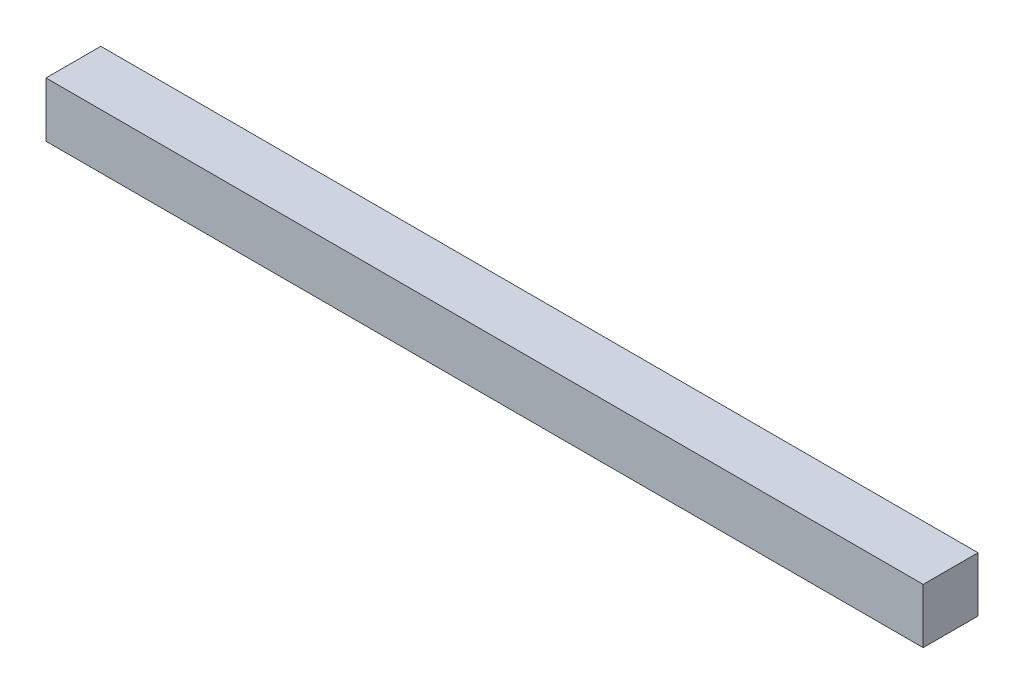
ISO-10303-21;
HEADER;
FILE_DESCRIPTION(('STEP AP214'),'2;1');
FILE_NAME('part.step','',(''),(''),'','','');
FILE_SCHEMA(('AUTOMOTIVE_DESIGN { 1 0 10303 214 1 1 1 1 }'));
ENDSEC;
DATA;
#1=APPLICATION_CONTEXT('core data for automotive mechanical design processes');
#2=APPLICATION_PROTOCOL_DEFINITION('international standard','automotive_design',2000,#1);
#3=PRODUCT_CONTEXT('',#1,'mechanical');
#4=PRODUCT('Part','Part','',(#3));
#5=PRODUCT_RELATED_PRODUCT_CATEGORY('part','',(#4));
#6=PRODUCT_DEFINITION_FORMATION('','',#4);
#7=PRODUCT_DEFINITION_CONTEXT('part definition',#1,'design');
#8=PRODUCT_DEFINITION('design','',#6,#7);
#9=PRODUCT_DEFINITION_SHAPE('','',#8);
#10=(LENGTH_UNIT() NAMED_UNIT(*) SI_UNIT(.MILLI.,.METRE.));
#11=(NAMED_UNIT(*) PLANE_ANGLE_UNIT() SI_UNIT($,.RADIAN.));
#12=(NAMED_UNIT(*) SI_UNIT($,.STERADIAN.) SOLID_ANGLE_UNIT());
#13=UNCERTAINTY_MEASURE_WITH_UNIT(LENGTH_MEASURE(1.E-05),#10,'distance_accuracy_value','');
#14=(GEOMETRIC_REPRESENTATION_CONTEXT(3) GLOBAL_UNCERTAINTY_ASSIGNED_CONTEXT((#13)) GLOBAL_UNIT_ASSIGNED_CONTEXT((#10,
#11,#12)) REPRESENTATION_CONTEXT('',''));
#15=CARTESIAN_POINT('',(0.,0.,0.));
#16=DIRECTION('',(0.,0.,1.));
#17=DIRECTION('',(1.,0.,0.));
#18=AXIS2_PLACEMENT_3D('',#15,#16,#17);
#19=CARTESIAN_POINT('',(50.8,6.35,3.175));
#20=DIRECTION('',(-1.,0.,0.));
#21=DIRECTION('',(0.,0.,1.));
#22=AXIS2_PLACEMENT_3D('',#19,#20,#21);
#23=PLANE('',#22);
#24=DIRECTION('',(0.,0.,-1.));
#25=VECTOR('',#24,1.);
#26=CARTESIAN_POINT('',(50.8,0.,3.175));
#27=LINE('',#26,#25);
#28=CARTESIAN_POINT('',(50.8,0.,3.175));
#29=VERTEX_POINT('',#28);
#30=CARTESIAN_POINT('',(50.8,0.,-3.175));
#31=VERTEX_POINT('',#30);
#32=EDGE_CURVE('E96',#29,#31,#27,.T.);
#33=ORIENTED_EDGE('',*,*,#32,.T.);
#34=DIRECTION('',(0.,-1.,0.));
#35=VECTOR('',#34,1.);
#36=CARTESIAN_POINT('',(50.8,6.35,-3.175));
#37=LINE('',#36,#35);
#38=CARTESIAN_POINT('',(50.8,6.35,-3.175));
#39=VERTEX_POINT('',#38);
#40=EDGE_CURVE('E11',#39,#31,#37,.T.);
#41=ORIENTED_EDGE('',*,*,#40,.F.);
#42=DIRECTION('',(0.,0.,-1.));
#43=VECTOR('',#42,1.);
#44=CARTESIAN_POINT('',(50.8,6.35,3.175));
#45=LINE('',#44,#43);
#46=CARTESIAN_POINT('',(50.8,6.35,3.175));
#47=VERTEX_POINT('',#46);
#48=EDGE_CURVE('E84',#47,#39,#45,.T.);
#49=ORIENTED_EDGE('',*,*,#48,.F.);
#50=DIRECTION('',(0.,-1.,0.));
#51=VECTOR('',#50,1.);
#52=CARTESIAN_POINT('',(50.8,6.35,3.175));
#53=LINE('',#52,#51);
#54=EDGE_CURVE('E92',#47,#29,#53,.T.);
#55=ORIENTED_EDGE('',*,*,#54,.T.);
#56=EDGE_LOOP('',(#33,#41,#49,#55));
#57=FACE_BOUND('',#56,.T.);
#58=ADVANCED_FACE('F33',(#57),#23,.F.);
#59=CARTESIAN_POINT('',(-50.8,6.35,-3.175));
#60=DIRECTION('',(0.,0.,1.));
#61=DIRECTION('',(1.,0.,0.));
#62=AXIS2_PLACEMENT_3D('',#59,#60,#61);
#63=PLANE('',#62);
#64=DIRECTION('',(-1.,0.,0.));
#65=VECTOR('',#64,1.);
#66=CARTESIAN_POINT('',(-50.8,0.,-3.175));
#67=LINE('',#66,#65);
#68=CARTESIAN_POINT('',(-50.8,0.,-3.175));
#69=VERTEX_POINT('',#68);
#70=EDGE_CURVE('E88',#31,#69,#67,.T.);
#71=ORIENTED_EDGE('',*,*,#70,.T.);
#72=DIRECTION('',(0.,-1.,0.));
#73=VECTOR('',#72,1.);
#74=CARTESIAN_POINT('',(-50.8,6.35,-3.175));
#75=LINE('',#74,#73);
#76=CARTESIAN_POINT('',(-50.8,6.35,-3.175));
#77=VERTEX_POINT('',#76);
#78=EDGE_CURVE('E41',#77,#69,#75,.T.);
#79=ORIENTED_EDGE('',*,*,#78,.F.);
#80=DIRECTION('',(-1.,0.,0.));
#81=VECTOR('',#80,1.);
#82=CARTESIAN_POINT('',(-50.8,6.35,-3.175));
#83=LINE('',#82,#81);
#84=EDGE_CURVE('E79',#39,#77,#83,.T.);
#85=ORIENTED_EDGE('',*,*,#84,.F.);
#86=ORIENTED_EDGE('',*,*,#40,.T.);
#87=EDGE_LOOP('',(#71,#79,#85,#86));
#88=FACE_BOUND('',#87,.T.);
#89=ADVANCED_FACE('F87',(#88),#63,.F.);
#90=CARTESIAN_POINT('',(-50.8,6.35,3.175));
#91=DIRECTION('',(1.,0.,0.));
#92=DIRECTION('',(0.,0.,-1.));
#93=AXIS2_PLACEMENT_3D('',#90,#91,#92);
#94=PLANE('',#93);
#95=DIRECTION('',(0.,0.,1.));
#96=VECTOR('',#95,1.);
#97=CARTESIAN_POINT('',(-50.8,0.,3.175));
#98=LINE('',#97,#96);
#99=CARTESIAN_POINT('',(-50.8,0.,3.175));
#100=VERTEX_POINT('',#99);
#101=EDGE_CURVE('E66',#69,#100,#98,.T.);
#102=ORIENTED_EDGE('',*,*,#101,.T.);
#103=DIRECTION('',(0.,-1.,0.));
#104=VECTOR('',#103,1.);
#105=CARTESIAN_POINT('',(-50.8,6.35,3.175));
#106=LINE('',#105,#104);
#107=CARTESIAN_POINT('',(-50.8,6.35,3.175));
#108=VERTEX_POINT('',#107);
#109=EDGE_CURVE('E89',#108,#100,#106,.T.);
#110=ORIENTED_EDGE('',*,*,#109,.F.);
#111=DIRECTION('',(0.,0.,1.));
#112=VECTOR('',#111,1.);
#113=CARTESIAN_POINT('',(-50.8,6.35,3.175));
#114=LINE('',#113,#112);
#115=EDGE_CURVE('E82',#77,#108,#114,.T.);
#116=ORIENTED_EDGE('',*,*,#115,.F.);
#117=ORIENTED_EDGE('',*,*,#78,.T.);
#118=EDGE_LOOP('',(#102,#110,#116,#117));
#119=FACE_BOUND('',#118,.T.);
#120=ADVANCED_FACE('F90',(#119),#94,.F.);
#121=CARTESIAN_POINT('',(-50.8,6.35,3.175));
#122=DIRECTION('',(0.,0.,-1.));
#123=DIRECTION('',(-1.,0.,0.));
#124=AXIS2_PLACEMENT_3D('',#121,#122,#123);
#125=PLANE('',#124);
#126=DIRECTION('',(1.,0.,0.));
#127=VECTOR('',#126,1.);
#128=CARTESIAN_POINT('',(-50.8,0.,3.175));
#129=LINE('',#128,#127);
#130=EDGE_CURVE('E72',#100,#29,#129,.T.);
#131=ORIENTED_EDGE('',*,*,#130,.T.);
#132=ORIENTED_EDGE('',*,*,#54,.F.);
#133=DIRECTION('',(1.,0.,0.));
#134=VECTOR('',#133,1.);
#135=CARTESIAN_POINT('',(-50.8,6.35,3.175));
#136=LINE('',#135,#134);
#137=EDGE_CURVE('E49',#108,#47,#136,.T.);
#138=ORIENTED_EDGE('',*,*,#137,.F.);
#139=ORIENTED_EDGE('',*,*,#109,.T.);
#140=EDGE_LOOP('',(#131,#132,#138,#139));
#141=FACE_BOUND('',#140,.T.);
#142=ADVANCED_FACE('F103',(#141),#125,.F.);
#143=CARTESIAN_POINT('',(0.,6.35,0.));
#144=DIRECTION('',(0.,-1.,0.));
#145=DIRECTION('',(0.,0.,-1.));
#146=AXIS2_PLACEMENT_3D('',#143,#144,#145);
#147=PLANE('',#146);
#148=ORIENTED_EDGE('',*,*,#48,.T.);
#149=ORIENTED_EDGE('',*,*,#84,.T.);
#150=ORIENTED_EDGE('',*,*,#115,.T.);
#151=ORIENTED_EDGE('',*,*,#137,.T.);
#152=EDGE_LOOP('',(#148,#149,#150,#151));
#153=FACE_BOUND('',#152,.T.);
#154=ADVANCED_FACE('F80',(#153),#147,.F.);
#155=CARTESIAN_POINT('',(0.,0.,0.));
#156=DIRECTION('',(0.,-1.,0.));
#157=DIRECTION('',(0.,0.,-1.));
#158=AXIS2_PLACEMENT_3D('',#155,#156,#157);
#159=PLANE('',#158);
#160=ORIENTED_EDGE('',*,*,#32,.F.);
#161=ORIENTED_EDGE('',*,*,#130,.F.);
#162=ORIENTED_EDGE('',*,*,#101,.F.);
#163=ORIENTED_EDGE('',*,*,#70,.F.);
#164=EDGE_LOOP('',(#160,#161,#162,#163));
#165=FACE_BOUND('',#164,.T.);
#166=ADVANCED_FACE('F106',(#165),#159,.T.);
#167=CLOSED_SHELL('',(#58,#89,#120,#142,#154,#166));
#168=MANIFOLD_SOLID_BREP('B2',#167);
#169=ADVANCED_BREP_SHAPE_REPRESENTATION('',(#18,#168),#14);
#170=SHAPE_DEFINITION_REPRESENTATION(#9,#169);
ENDSEC;
END-ISO-10303-21;
